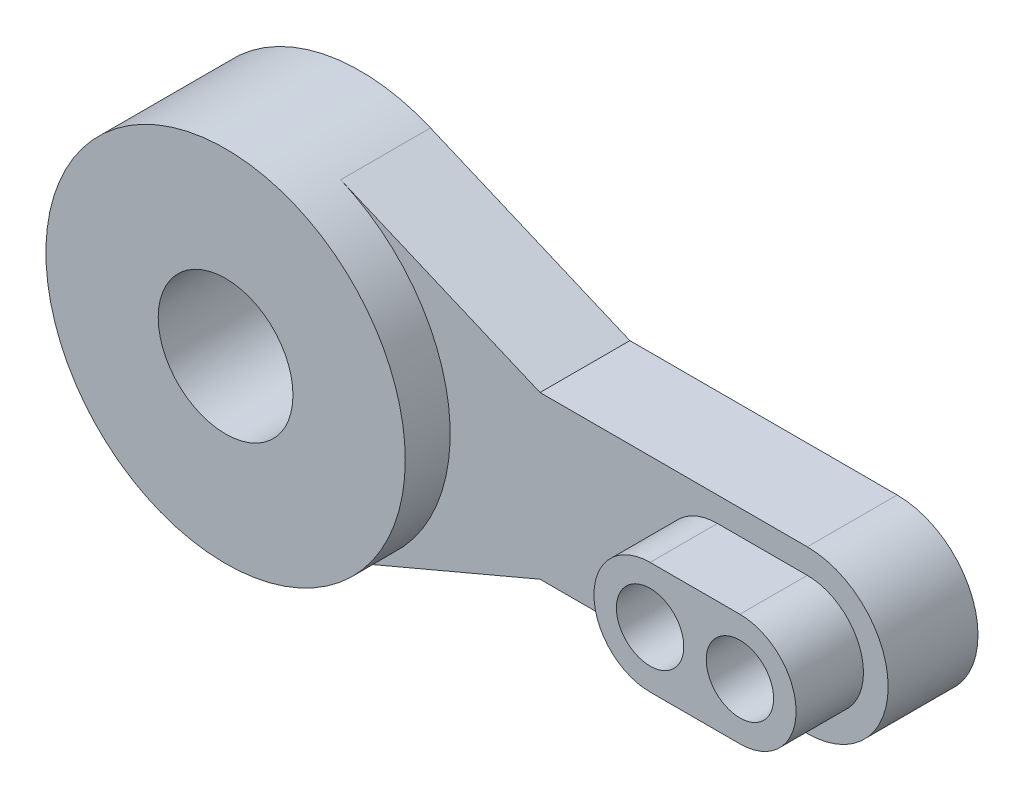
ISO-10303-21;
HEADER;
FILE_DESCRIPTION(('STEP AP214'),'2;1');
FILE_NAME('part.step','',(''),(''),'','','');
FILE_SCHEMA(('AUTOMOTIVE_DESIGN { 1 0 10303 214 1 1 1 1 }'));
ENDSEC;
DATA;
#1=APPLICATION_CONTEXT('core data for automotive mechanical design processes');
#2=APPLICATION_PROTOCOL_DEFINITION('international standard','automotive_design',2000,#1);
#3=PRODUCT_CONTEXT('',#1,'mechanical');
#4=PRODUCT('Part','Part','',(#3));
#5=PRODUCT_RELATED_PRODUCT_CATEGORY('part','',(#4));
#6=PRODUCT_DEFINITION_FORMATION('','',#4);
#7=PRODUCT_DEFINITION_CONTEXT('part definition',#1,'design');
#8=PRODUCT_DEFINITION('design','',#6,#7);
#9=PRODUCT_DEFINITION_SHAPE('','',#8);
#10=(LENGTH_UNIT() NAMED_UNIT(*) SI_UNIT(.MILLI.,.METRE.));
#11=(NAMED_UNIT(*) PLANE_ANGLE_UNIT() SI_UNIT($,.RADIAN.));
#12=(NAMED_UNIT(*) SI_UNIT($,.STERADIAN.) SOLID_ANGLE_UNIT());
#13=UNCERTAINTY_MEASURE_WITH_UNIT(LENGTH_MEASURE(1.E-05),#10,'distance_accuracy_value','');
#14=(GEOMETRIC_REPRESENTATION_CONTEXT(3) GLOBAL_UNCERTAINTY_ASSIGNED_CONTEXT((#13)) GLOBAL_UNIT_ASSIGNED_CONTEXT((#10,
#11,#12)) REPRESENTATION_CONTEXT('',''));
#15=CARTESIAN_POINT('',(0.,0.,0.));
#16=DIRECTION('',(0.,0.,1.));
#17=DIRECTION('',(1.,0.,0.));
#18=AXIS2_PLACEMENT_3D('',#15,#16,#17);
#19=CARTESIAN_POINT('',(0.,0.,4.));
#20=DIRECTION('',(0.,0.,1.));
#21=DIRECTION('',(1.,0.,0.));
#22=AXIS2_PLACEMENT_3D('',#19,#20,#21);
#23=PLANE('',#22);
#24=CARTESIAN_POINT('',(0.,0.,4.));
#25=DIRECTION('',(0.,0.,1.));
#26=DIRECTION('',(1.,0.,0.));
#27=AXIS2_PLACEMENT_3D('',#24,#25,#26);
#28=CIRCLE('',#27,8.);
#29=CARTESIAN_POINT('',(3.12386973066267,-7.36487867556891,4.));
#30=VERTEX_POINT('',#29);
#31=CARTESIAN_POINT('',(3.12386973066266,7.3648786755689,4.));
#32=VERTEX_POINT('',#31);
#33=EDGE_CURVE('E11',#30,#32,#28,.T.);
#34=ORIENTED_EDGE('',*,*,#33,.F.);
#35=DIRECTION('',(0.920609834446113,0.390483716332833,0.));
#36=VECTOR('',#35,1.);
#37=CARTESIAN_POINT('',(3.12386973066267,-7.36487867556891,4.));
#38=LINE('',#37,#36);
#39=CARTESIAN_POINT('',(12.,-3.6,4.));
#40=VERTEX_POINT('',#39);
#41=EDGE_CURVE('E104',#30,#40,#38,.T.);
#42=ORIENTED_EDGE('',*,*,#41,.T.);
#43=DIRECTION('',(1.,0.,0.));
#44=VECTOR('',#43,1.);
#45=CARTESIAN_POINT('',(12.,-3.6,4.));
#46=LINE('',#45,#44);
#47=CARTESIAN_POINT('',(23.9,-3.6,4.));
#48=VERTEX_POINT('',#47);
#49=EDGE_CURVE('E98',#40,#48,#46,.T.);
#50=ORIENTED_EDGE('',*,*,#49,.T.);
#51=CARTESIAN_POINT('',(23.9,0.,4.));
#52=DIRECTION('',(0.,0.,1.));
#53=DIRECTION('',(1.,0.,0.));
#54=AXIS2_PLACEMENT_3D('',#51,#52,#53);
#55=CIRCLE('',#54,3.6);
#56=CARTESIAN_POINT('',(23.9,3.6,4.));
#57=VERTEX_POINT('',#56);
#58=EDGE_CURVE('E102',#48,#57,#55,.T.);
#59=ORIENTED_EDGE('',*,*,#58,.T.);
#60=DIRECTION('',(-1.,0.,0.));
#61=VECTOR('',#60,1.);
#62=CARTESIAN_POINT('',(12.,3.6,4.));
#63=LINE('',#62,#61);
#64=CARTESIAN_POINT('',(12.,3.6,4.));
#65=VERTEX_POINT('',#64);
#66=EDGE_CURVE('E58',#57,#65,#63,.T.);
#67=ORIENTED_EDGE('',*,*,#66,.T.);
#68=DIRECTION('',(-0.920609834446113,0.390483716332833,0.));
#69=VECTOR('',#68,1.);
#70=CARTESIAN_POINT('',(3.12386973066267,7.36487867556891,4.));
#71=LINE('',#70,#69);
#72=EDGE_CURVE('E122',#65,#32,#71,.T.);
#73=ORIENTED_EDGE('',*,*,#72,.T.);
#74=EDGE_LOOP('',(#34,#42,#50,#59,#67,#73));
#75=FACE_BOUND('',#74,.T.);
#76=DIRECTION('',(-1.,0.,0.));
#77=VECTOR('',#76,1.);
#78=CARTESIAN_POINT('',(23.9,2.5,4.));
#79=LINE('',#78,#77);
#80=CARTESIAN_POINT('',(23.9,2.5,4.));
#81=VERTEX_POINT('',#80);
#82=CARTESIAN_POINT('',(19.9,2.5,4.));
#83=VERTEX_POINT('',#82);
#84=EDGE_CURVE('E197',#81,#83,#79,.T.);
#85=ORIENTED_EDGE('',*,*,#84,.F.);
#86=CARTESIAN_POINT('',(23.9,0.,4.));
#87=DIRECTION('',(0.,0.,1.));
#88=DIRECTION('',(1.,0.,0.));
#89=AXIS2_PLACEMENT_3D('',#86,#87,#88);
#90=CIRCLE('',#89,2.5);
#91=CARTESIAN_POINT('',(23.9,-2.5,4.));
#92=VERTEX_POINT('',#91);
#93=EDGE_CURVE('E208',#92,#81,#90,.T.);
#94=ORIENTED_EDGE('',*,*,#93,.F.);
#95=DIRECTION('',(1.,0.,0.));
#96=VECTOR('',#95,1.);
#97=CARTESIAN_POINT('',(23.9,-2.5,4.));
#98=LINE('',#97,#96);
#99=CARTESIAN_POINT('',(19.9,-2.5,4.));
#100=VERTEX_POINT('',#99);
#101=EDGE_CURVE('E178',#100,#92,#98,.T.);
#102=ORIENTED_EDGE('',*,*,#101,.F.);
#103=CARTESIAN_POINT('',(19.9,0.,4.));
#104=DIRECTION('',(0.,0.,1.));
#105=DIRECTION('',(1.,0.,0.));
#106=AXIS2_PLACEMENT_3D('',#103,#104,#105);
#107=CIRCLE('',#106,2.5);
#108=EDGE_CURVE('E213',#83,#100,#107,.T.);
#109=ORIENTED_EDGE('',*,*,#108,.F.);
#110=EDGE_LOOP('',(#85,#94,#102,#109));
#111=FACE_BOUND('',#110,.T.);
#112=ADVANCED_FACE('F33',(#75,#111),#23,.T.);
#113=CARTESIAN_POINT('',(0.,0.,4.));
#114=DIRECTION('',(0.,0.,-1.));
#115=DIRECTION('',(-1.,0.,0.));
#116=AXIS2_PLACEMENT_3D('',#113,#114,#115);
#117=CYLINDRICAL_SURFACE('',#116,8.);
#118=CARTESIAN_POINT('',(0.,0.,0.));
#119=DIRECTION('',(0.,0.,1.));
#120=DIRECTION('',(1.,0.,0.));
#121=AXIS2_PLACEMENT_3D('',#118,#119,#120);
#122=CIRCLE('',#121,8.);
#123=CARTESIAN_POINT('',(3.12386973066267,7.36487867556891,0.));
#124=VERTEX_POINT('',#123);
#125=CARTESIAN_POINT('',(3.12386973066267,-7.36487867556891,0.));
#126=VERTEX_POINT('',#125);
#127=EDGE_CURVE('E128',#124,#126,#122,.T.);
#128=ORIENTED_EDGE('',*,*,#127,.T.);
#129=DIRECTION('',(0.,0.,-1.));
#130=VECTOR('',#129,1.);
#131=CARTESIAN_POINT('',(3.12386973066267,-7.36487867556891,4.));
#132=LINE('',#131,#130);
#133=EDGE_CURVE('E37',#30,#126,#132,.T.);
#134=ORIENTED_EDGE('',*,*,#133,.F.);
#135=ORIENTED_EDGE('',*,*,#33,.T.);
#136=DIRECTION('',(0.,0.,-1.));
#137=VECTOR('',#136,1.);
#138=CARTESIAN_POINT('',(3.12386973066267,7.36487867556891,4.));
#139=LINE('',#138,#137);
#140=EDGE_CURVE('E127',#32,#124,#139,.T.);
#141=ORIENTED_EDGE('',*,*,#140,.T.);
#142=EDGE_LOOP('',(#128,#134,#135,#141));
#143=FACE_BOUND('',#142,.T.);
#144=CARTESIAN_POINT('',(0.,0.,6.));
#145=DIRECTION('',(0.,0.,1.));
#146=DIRECTION('',(1.,0.,0.));
#147=AXIS2_PLACEMENT_3D('',#144,#145,#146);
#148=CIRCLE('',#147,8.);
#149=CARTESIAN_POINT('',(8.,0.,6.));
#150=VERTEX_POINT('',#149);
#151=EDGE_CURVE('E132',#150,#150,#148,.T.);
#152=ORIENTED_EDGE('',*,*,#151,.F.);
#153=EDGE_LOOP('',(#152));
#154=FACE_BOUND('',#153,.T.);
#155=ADVANCED_FACE('F35',(#143,#154),#117,.T.);
#156=CARTESIAN_POINT('',(3.12386973066267,-7.36487867556891,4.));
#157=DIRECTION('',(-0.390483716332833,0.920609834446113,0.));
#158=DIRECTION('',(-0.920609834446113,-0.390483716332833,0.));
#159=AXIS2_PLACEMENT_3D('',#156,#157,#158);
#160=PLANE('',#159);
#161=DIRECTION('',(0.920609834446113,0.390483716332833,0.));
#162=VECTOR('',#161,1.);
#163=CARTESIAN_POINT('',(3.12386973066267,-7.36487867556891,0.));
#164=LINE('',#163,#162);
#165=CARTESIAN_POINT('',(12.,-3.6,0.));
#166=VERTEX_POINT('',#165);
#167=EDGE_CURVE('E131',#126,#166,#164,.T.);
#168=ORIENTED_EDGE('',*,*,#167,.T.);
#169=DIRECTION('',(0.,0.,-1.));
#170=VECTOR('',#169,1.);
#171=CARTESIAN_POINT('',(12.,-3.6,4.));
#172=LINE('',#171,#170);
#173=EDGE_CURVE('E116',#40,#166,#172,.T.);
#174=ORIENTED_EDGE('',*,*,#173,.F.);
#175=ORIENTED_EDGE('',*,*,#41,.F.);
#176=ORIENTED_EDGE('',*,*,#133,.T.);
#177=EDGE_LOOP('',(#168,#174,#175,#176));
#178=FACE_BOUND('',#177,.T.);
#179=ADVANCED_FACE('F146',(#178),#160,.F.);
#180=CARTESIAN_POINT('',(12.,-3.6,4.));
#181=DIRECTION('',(0.,1.,0.));
#182=DIRECTION('',(-1.,0.,0.));
#183=AXIS2_PLACEMENT_3D('',#180,#181,#182);
#184=PLANE('',#183);
#185=DIRECTION('',(1.,0.,0.));
#186=VECTOR('',#185,1.);
#187=CARTESIAN_POINT('',(12.,-3.6,0.));
#188=LINE('',#187,#186);
#189=CARTESIAN_POINT('',(23.9,-3.6,0.));
#190=VERTEX_POINT('',#189);
#191=EDGE_CURVE('E113',#166,#190,#188,.T.);
#192=ORIENTED_EDGE('',*,*,#191,.T.);
#193=DIRECTION('',(0.,0.,-1.));
#194=VECTOR('',#193,1.);
#195=CARTESIAN_POINT('',(23.9,-3.6,4.));
#196=LINE('',#195,#194);
#197=EDGE_CURVE('E110',#48,#190,#196,.T.);
#198=ORIENTED_EDGE('',*,*,#197,.F.);
#199=ORIENTED_EDGE('',*,*,#49,.F.);
#200=ORIENTED_EDGE('',*,*,#173,.T.);
#201=EDGE_LOOP('',(#192,#198,#199,#200));
#202=FACE_BOUND('',#201,.T.);
#203=ADVANCED_FACE('F111',(#202),#184,.F.);
#204=CARTESIAN_POINT('',(23.9,0.,4.));
#205=DIRECTION('',(0.,0.,-1.));
#206=DIRECTION('',(-1.,0.,0.));
#207=AXIS2_PLACEMENT_3D('',#204,#205,#206);
#208=CYLINDRICAL_SURFACE('',#207,3.6);
#209=CARTESIAN_POINT('',(23.9,0.,0.));
#210=DIRECTION('',(0.,0.,1.));
#211=DIRECTION('',(1.,0.,0.));
#212=AXIS2_PLACEMENT_3D('',#209,#210,#211);
#213=CIRCLE('',#212,3.6);
#214=CARTESIAN_POINT('',(23.9,3.6,0.));
#215=VERTEX_POINT('',#214);
#216=EDGE_CURVE('E135',#190,#215,#213,.T.);
#217=ORIENTED_EDGE('',*,*,#216,.T.);
#218=DIRECTION('',(0.,0.,-1.));
#219=VECTOR('',#218,1.);
#220=CARTESIAN_POINT('',(23.9,3.6,4.));
#221=LINE('',#220,#219);
#222=EDGE_CURVE('E117',#57,#215,#221,.T.);
#223=ORIENTED_EDGE('',*,*,#222,.F.);
#224=ORIENTED_EDGE('',*,*,#58,.F.);
#225=ORIENTED_EDGE('',*,*,#197,.T.);
#226=EDGE_LOOP('',(#217,#223,#224,#225));
#227=FACE_BOUND('',#226,.T.);
#228=ADVANCED_FACE('F119',(#227),#208,.T.);
#229=CARTESIAN_POINT('',(12.,3.6,4.));
#230=DIRECTION('',(0.,-1.,0.));
#231=DIRECTION('',(1.,0.,0.));
#232=AXIS2_PLACEMENT_3D('',#229,#230,#231);
#233=PLANE('',#232);
#234=DIRECTION('',(-1.,0.,0.));
#235=VECTOR('',#234,1.);
#236=CARTESIAN_POINT('',(12.,3.6,0.));
#237=LINE('',#236,#235);
#238=CARTESIAN_POINT('',(12.,3.6,0.));
#239=VERTEX_POINT('',#238);
#240=EDGE_CURVE('E137',#215,#239,#237,.T.);
#241=ORIENTED_EDGE('',*,*,#240,.T.);
#242=DIRECTION('',(0.,0.,-1.));
#243=VECTOR('',#242,1.);
#244=CARTESIAN_POINT('',(12.,3.6,4.));
#245=LINE('',#244,#243);
#246=EDGE_CURVE('E141',#65,#239,#245,.T.);
#247=ORIENTED_EDGE('',*,*,#246,.F.);
#248=ORIENTED_EDGE('',*,*,#66,.F.);
#249=ORIENTED_EDGE('',*,*,#222,.T.);
#250=EDGE_LOOP('',(#241,#247,#248,#249));
#251=FACE_BOUND('',#250,.T.);
#252=ADVANCED_FACE('F154',(#251),#233,.F.);
#253=CARTESIAN_POINT('',(3.12386973066267,7.36487867556891,4.));
#254=DIRECTION('',(-0.390483716332833,-0.920609834446113,0.));
#255=DIRECTION('',(0.920609834446113,-0.390483716332833,0.));
#256=AXIS2_PLACEMENT_3D('',#253,#254,#255);
#257=PLANE('',#256);
#258=DIRECTION('',(-0.920609834446113,0.390483716332833,0.));
#259=VECTOR('',#258,1.);
#260=CARTESIAN_POINT('',(3.12386973066267,7.36487867556891,0.));
#261=LINE('',#260,#259);
#262=EDGE_CURVE('E86',#239,#124,#261,.T.);
#263=ORIENTED_EDGE('',*,*,#262,.T.);
#264=ORIENTED_EDGE('',*,*,#140,.F.);
#265=ORIENTED_EDGE('',*,*,#72,.F.);
#266=ORIENTED_EDGE('',*,*,#246,.T.);
#267=EDGE_LOOP('',(#263,#264,#265,#266));
#268=FACE_BOUND('',#267,.T.);
#269=ADVANCED_FACE('F156',(#268),#257,.F.);
#270=CARTESIAN_POINT('',(0.,0.,0.));
#271=DIRECTION('',(0.,0.,1.));
#272=DIRECTION('',(1.,0.,0.));
#273=AXIS2_PLACEMENT_3D('',#270,#271,#272);
#274=PLANE('',#273);
#275=CARTESIAN_POINT('',(0.,0.,0.));
#276=DIRECTION('',(0.,0.,-1.));
#277=DIRECTION('',(-1.,0.,0.));
#278=AXIS2_PLACEMENT_3D('',#275,#276,#277);
#279=CIRCLE('',#278,3.);
#280=CARTESIAN_POINT('',(-3.,0.,0.));
#281=VERTEX_POINT('',#280);
#282=EDGE_CURVE('E378',#281,#281,#279,.T.);
#283=ORIENTED_EDGE('',*,*,#282,.F.);
#284=EDGE_LOOP('',(#283));
#285=FACE_BOUND('',#284,.T.);
#286=CARTESIAN_POINT('',(23.9,0.,0.));
#287=DIRECTION('',(0.,0.,-1.));
#288=DIRECTION('',(-1.,0.,0.));
#289=AXIS2_PLACEMENT_3D('',#286,#287,#288);
#290=CIRCLE('',#289,1.49999999999999);
#291=CARTESIAN_POINT('',(22.4,0.,0.));
#292=VERTEX_POINT('',#291);
#293=EDGE_CURVE('E380',#292,#292,#290,.T.);
#294=ORIENTED_EDGE('',*,*,#293,.F.);
#295=EDGE_LOOP('',(#294));
#296=FACE_BOUND('',#295,.T.);
#297=CARTESIAN_POINT('',(19.9,0.,0.));
#298=DIRECTION('',(0.,0.,-1.));
#299=DIRECTION('',(-1.,0.,0.));
#300=AXIS2_PLACEMENT_3D('',#297,#298,#299);
#301=CIRCLE('',#300,1.49999999999999);
#302=CARTESIAN_POINT('',(18.4,0.,0.));
#303=VERTEX_POINT('',#302);
#304=EDGE_CURVE('E388',#303,#303,#301,.T.);
#305=ORIENTED_EDGE('',*,*,#304,.F.);
#306=EDGE_LOOP('',(#305));
#307=FACE_BOUND('',#306,.T.);
#308=ORIENTED_EDGE('',*,*,#127,.F.);
#309=ORIENTED_EDGE('',*,*,#262,.F.);
#310=ORIENTED_EDGE('',*,*,#240,.F.);
#311=ORIENTED_EDGE('',*,*,#216,.F.);
#312=ORIENTED_EDGE('',*,*,#191,.F.);
#313=ORIENTED_EDGE('',*,*,#167,.F.);
#314=EDGE_LOOP('',(#308,#309,#310,#311,#312,#313));
#315=FACE_BOUND('',#314,.T.);
#316=ADVANCED_FACE('F151',(#285,#296,#307,#315),#274,.F.);
#317=CARTESIAN_POINT('',(0.,0.,6.));
#318=DIRECTION('',(0.,0.,1.));
#319=DIRECTION('',(1.,0.,0.));
#320=AXIS2_PLACEMENT_3D('',#317,#318,#319);
#321=PLANE('',#320);
#322=CARTESIAN_POINT('',(0.,0.,6.));
#323=DIRECTION('',(0.,0.,1.));
#324=DIRECTION('',(1.,0.,0.));
#325=AXIS2_PLACEMENT_3D('',#322,#323,#324);
#326=CIRCLE('',#325,3.);
#327=CARTESIAN_POINT('',(3.,0.,6.));
#328=VERTEX_POINT('',#327);
#329=EDGE_CURVE('E375',#328,#328,#326,.T.);
#330=ORIENTED_EDGE('',*,*,#329,.F.);
#331=EDGE_LOOP('',(#330));
#332=FACE_BOUND('',#331,.T.);
#333=ORIENTED_EDGE('',*,*,#151,.T.);
#334=EDGE_LOOP('',(#333));
#335=FACE_BOUND('',#334,.T.);
#336=ADVANCED_FACE('F222',(#332,#335),#321,.T.);
#337=CARTESIAN_POINT('',(23.9,0.,7.));
#338=DIRECTION('',(0.,0.,-1.));
#339=DIRECTION('',(-1.,0.,0.));
#340=AXIS2_PLACEMENT_3D('',#337,#338,#339);
#341=CYLINDRICAL_SURFACE('',#340,2.5);
#342=ORIENTED_EDGE('',*,*,#93,.T.);
#343=DIRECTION('',(0.,0.,-1.));
#344=VECTOR('',#343,1.);
#345=CARTESIAN_POINT('',(23.9,2.5,7.));
#346=LINE('',#345,#344);
#347=CARTESIAN_POINT('',(23.9,2.5,7.));
#348=VERTEX_POINT('',#347);
#349=EDGE_CURVE('E200',#348,#81,#346,.T.);
#350=ORIENTED_EDGE('',*,*,#349,.F.);
#351=CARTESIAN_POINT('',(23.9,0.,7.));
#352=DIRECTION('',(0.,0.,1.));
#353=DIRECTION('',(1.,0.,0.));
#354=AXIS2_PLACEMENT_3D('',#351,#352,#353);
#355=CIRCLE('',#354,2.5);
#356=CARTESIAN_POINT('',(23.9,-2.5,7.));
#357=VERTEX_POINT('',#356);
#358=EDGE_CURVE('E190',#357,#348,#355,.T.);
#359=ORIENTED_EDGE('',*,*,#358,.F.);
#360=DIRECTION('',(0.,0.,-1.));
#361=VECTOR('',#360,1.);
#362=CARTESIAN_POINT('',(23.9,-2.5,7.));
#363=LINE('',#362,#361);
#364=EDGE_CURVE('E204',#357,#92,#363,.T.);
#365=ORIENTED_EDGE('',*,*,#364,.T.);
#366=EDGE_LOOP('',(#342,#350,#359,#365));
#367=FACE_BOUND('',#366,.T.);
#368=ADVANCED_FACE('F271',(#367),#341,.T.);
#369=CARTESIAN_POINT('',(23.9,2.5,7.));
#370=DIRECTION('',(0.,-1.,0.));
#371=DIRECTION('',(0.,0.,-1.));
#372=AXIS2_PLACEMENT_3D('',#369,#370,#371);
#373=PLANE('',#372);
#374=ORIENTED_EDGE('',*,*,#84,.T.);
#375=DIRECTION('',(0.,0.,-1.));
#376=VECTOR('',#375,1.);
#377=CARTESIAN_POINT('',(19.9,2.5,7.));
#378=LINE('',#377,#376);
#379=CARTESIAN_POINT('',(19.9,2.5,7.));
#380=VERTEX_POINT('',#379);
#381=EDGE_CURVE('E194',#380,#83,#378,.T.);
#382=ORIENTED_EDGE('',*,*,#381,.F.);
#383=DIRECTION('',(-1.,0.,0.));
#384=VECTOR('',#383,1.);
#385=CARTESIAN_POINT('',(23.9,2.5,7.));
#386=LINE('',#385,#384);
#387=EDGE_CURVE('E185',#348,#380,#386,.T.);
#388=ORIENTED_EDGE('',*,*,#387,.F.);
#389=ORIENTED_EDGE('',*,*,#349,.T.);
#390=EDGE_LOOP('',(#374,#382,#388,#389));
#391=FACE_BOUND('',#390,.T.);
#392=ADVANCED_FACE('F195',(#391),#373,.F.);
#393=CARTESIAN_POINT('',(19.9,0.,7.));
#394=DIRECTION('',(0.,0.,-1.));
#395=DIRECTION('',(-1.,0.,0.));
#396=AXIS2_PLACEMENT_3D('',#393,#394,#395);
#397=CYLINDRICAL_SURFACE('',#396,2.5);
#398=ORIENTED_EDGE('',*,*,#108,.T.);
#399=DIRECTION('',(0.,0.,-1.));
#400=VECTOR('',#399,1.);
#401=CARTESIAN_POINT('',(19.9,-2.5,7.));
#402=LINE('',#401,#400);
#403=CARTESIAN_POINT('',(19.9,-2.5,7.));
#404=VERTEX_POINT('',#403);
#405=EDGE_CURVE('E49',#404,#100,#402,.T.);
#406=ORIENTED_EDGE('',*,*,#405,.F.);
#407=CARTESIAN_POINT('',(19.9,0.,7.));
#408=DIRECTION('',(0.,0.,1.));
#409=DIRECTION('',(1.,0.,0.));
#410=AXIS2_PLACEMENT_3D('',#407,#408,#409);
#411=CIRCLE('',#410,2.5);
#412=EDGE_CURVE('E188',#380,#404,#411,.T.);
#413=ORIENTED_EDGE('',*,*,#412,.F.);
#414=ORIENTED_EDGE('',*,*,#381,.T.);
#415=EDGE_LOOP('',(#398,#406,#413,#414));
#416=FACE_BOUND('',#415,.T.);
#417=ADVANCED_FACE('F202',(#416),#397,.T.);
#418=CARTESIAN_POINT('',(23.9,-2.5,7.));
#419=DIRECTION('',(0.,1.,0.));
#420=DIRECTION('',(-1.,0.,0.));
#421=AXIS2_PLACEMENT_3D('',#418,#419,#420);
#422=PLANE('',#421);
#423=ORIENTED_EDGE('',*,*,#101,.T.);
#424=ORIENTED_EDGE('',*,*,#364,.F.);
#425=DIRECTION('',(1.,0.,0.));
#426=VECTOR('',#425,1.);
#427=CARTESIAN_POINT('',(23.9,-2.5,7.));
#428=LINE('',#427,#426);
#429=EDGE_CURVE('E164',#404,#357,#428,.T.);
#430=ORIENTED_EDGE('',*,*,#429,.F.);
#431=ORIENTED_EDGE('',*,*,#405,.T.);
#432=EDGE_LOOP('',(#423,#424,#430,#431));
#433=FACE_BOUND('',#432,.T.);
#434=ADVANCED_FACE('F291',(#433),#422,.F.);
#435=CARTESIAN_POINT('',(23.9,0.,7.));
#436=DIRECTION('',(0.,0.,1.));
#437=DIRECTION('',(1.,0.,0.));
#438=AXIS2_PLACEMENT_3D('',#435,#436,#437);
#439=PLANE('',#438);
#440=CARTESIAN_POINT('',(23.9,0.,7.));
#441=DIRECTION('',(0.,0.,-1.));
#442=DIRECTION('',(-1.,0.,0.));
#443=AXIS2_PLACEMENT_3D('',#440,#441,#442);
#444=CIRCLE('',#443,1.5);
#445=CARTESIAN_POINT('',(22.4,0.,7.));
#446=VERTEX_POINT('',#445);
#447=EDGE_CURVE('E385',#446,#446,#444,.T.);
#448=ORIENTED_EDGE('',*,*,#447,.T.);
#449=EDGE_LOOP('',(#448));
#450=FACE_BOUND('',#449,.T.);
#451=CARTESIAN_POINT('',(19.9,0.,7.));
#452=DIRECTION('',(0.,0.,-1.));
#453=DIRECTION('',(-1.,0.,0.));
#454=AXIS2_PLACEMENT_3D('',#451,#452,#453);
#455=CIRCLE('',#454,1.5);
#456=CARTESIAN_POINT('',(18.4,0.,7.));
#457=VERTEX_POINT('',#456);
#458=EDGE_CURVE('E211',#457,#457,#455,.T.);
#459=ORIENTED_EDGE('',*,*,#458,.T.);
#460=EDGE_LOOP('',(#459));
#461=FACE_BOUND('',#460,.T.);
#462=ORIENTED_EDGE('',*,*,#358,.T.);
#463=ORIENTED_EDGE('',*,*,#387,.T.);
#464=ORIENTED_EDGE('',*,*,#412,.T.);
#465=ORIENTED_EDGE('',*,*,#429,.T.);
#466=EDGE_LOOP('',(#462,#463,#464,#465));
#467=FACE_BOUND('',#466,.T.);
#468=ADVANCED_FACE('F186',(#450,#461,#467),#439,.T.);
#469=CARTESIAN_POINT('',(19.9,0.,0.));
#470=DIRECTION('',(0.,0.,-1.));
#471=DIRECTION('',(-1.,0.,0.));
#472=AXIS2_PLACEMENT_3D('',#469,#470,#471);
#473=CYLINDRICAL_SURFACE('',#472,1.49999999999999);
#474=ORIENTED_EDGE('',*,*,#458,.F.);
#475=EDGE_LOOP('',(#474));
#476=FACE_BOUND('',#475,.T.);
#477=ORIENTED_EDGE('',*,*,#304,.T.);
#478=EDGE_LOOP('',(#477));
#479=FACE_BOUND('',#478,.T.);
#480=ADVANCED_FACE('F304',(#476,#479),#473,.F.);
#481=CARTESIAN_POINT('',(23.9,0.,0.));
#482=DIRECTION('',(0.,0.,-1.));
#483=DIRECTION('',(-1.,0.,0.));
#484=AXIS2_PLACEMENT_3D('',#481,#482,#483);
#485=CYLINDRICAL_SURFACE('',#484,1.49999999999999);
#486=ORIENTED_EDGE('',*,*,#447,.F.);
#487=EDGE_LOOP('',(#486));
#488=FACE_BOUND('',#487,.T.);
#489=ORIENTED_EDGE('',*,*,#293,.T.);
#490=EDGE_LOOP('',(#489));
#491=FACE_BOUND('',#490,.T.);
#492=ADVANCED_FACE('F312',(#488,#491),#485,.F.);
#493=CARTESIAN_POINT('',(0.,0.,0.));
#494=DIRECTION('',(0.,0.,-1.));
#495=DIRECTION('',(-1.,0.,0.));
#496=AXIS2_PLACEMENT_3D('',#493,#494,#495);
#497=CYLINDRICAL_SURFACE('',#496,3.);
#498=ORIENTED_EDGE('',*,*,#329,.T.);
#499=EDGE_LOOP('',(#498));
#500=FACE_BOUND('',#499,.T.);
#501=ORIENTED_EDGE('',*,*,#282,.T.);
#502=EDGE_LOOP('',(#501));
#503=FACE_BOUND('',#502,.T.);
#504=ADVANCED_FACE('F319',(#500,#503),#497,.F.);
#505=CLOSED_SHELL('',(#112,#155,#179,#203,#228,#252,#269,#316,#336,#368,#392,#417,#434,#468,
#480,#492,#504));
#506=MANIFOLD_SOLID_BREP('B2',#505);
#507=ADVANCED_BREP_SHAPE_REPRESENTATION('',(#18,#506),#14);
#508=SHAPE_DEFINITION_REPRESENTATION(#9,#507);
ENDSEC;
END-ISO-10303-21;
